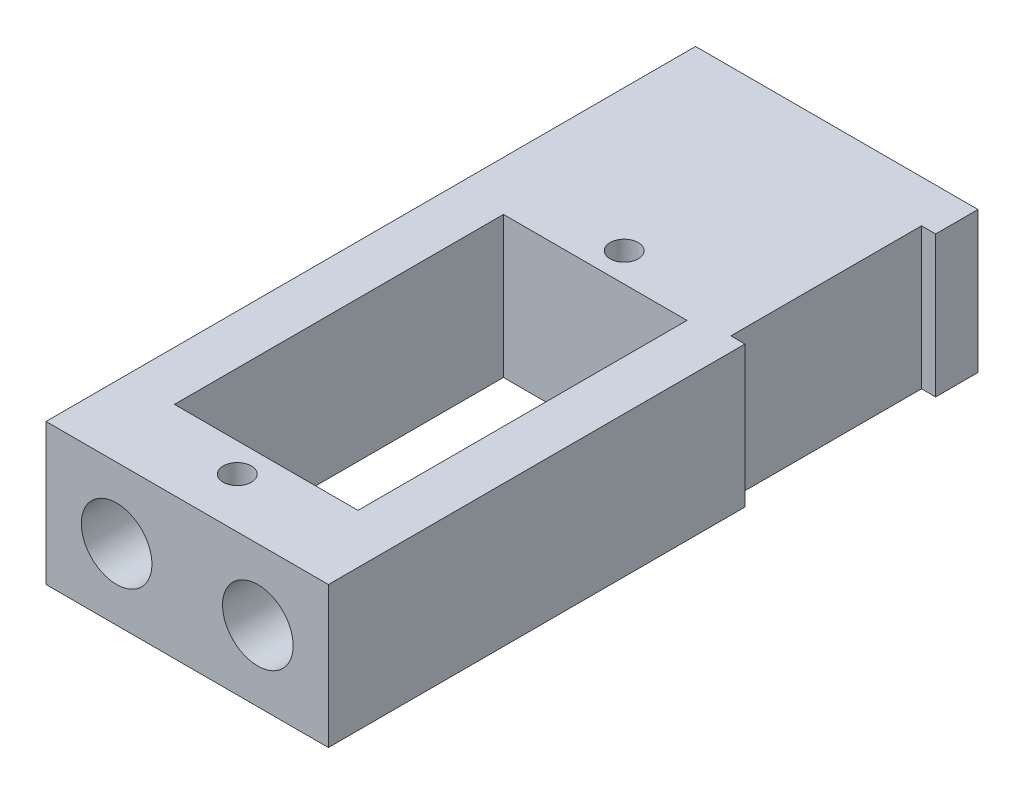
ISO-10303-21;
HEADER;
FILE_DESCRIPTION(('STEP AP214'),'2;1');
FILE_NAME('part.step','',(''),(''),'','','');
FILE_SCHEMA(('AUTOMOTIVE_DESIGN { 1 0 10303 214 1 1 1 1 }'));
ENDSEC;
DATA;
#1=APPLICATION_CONTEXT('core data for automotive mechanical design processes');
#2=APPLICATION_PROTOCOL_DEFINITION('international standard','automotive_design',2000,#1);
#3=PRODUCT_CONTEXT('',#1,'mechanical');
#4=PRODUCT('Part','Part','',(#3));
#5=PRODUCT_RELATED_PRODUCT_CATEGORY('part','',(#4));
#6=PRODUCT_DEFINITION_FORMATION('','',#4);
#7=PRODUCT_DEFINITION_CONTEXT('part definition',#1,'design');
#8=PRODUCT_DEFINITION('design','',#6,#7);
#9=PRODUCT_DEFINITION_SHAPE('','',#8);
#10=(LENGTH_UNIT() NAMED_UNIT(*) SI_UNIT(.MILLI.,.METRE.));
#11=(NAMED_UNIT(*) PLANE_ANGLE_UNIT() SI_UNIT($,.RADIAN.));
#12=(NAMED_UNIT(*) SI_UNIT($,.STERADIAN.) SOLID_ANGLE_UNIT());
#13=UNCERTAINTY_MEASURE_WITH_UNIT(LENGTH_MEASURE(1.E-05),#10,'distance_accuracy_value','');
#14=(GEOMETRIC_REPRESENTATION_CONTEXT(3) GLOBAL_UNCERTAINTY_ASSIGNED_CONTEXT((#13)) GLOBAL_UNIT_ASSIGNED_CONTEXT((#10,
#11,#12)) REPRESENTATION_CONTEXT('',''));
#15=CARTESIAN_POINT('',(0.,0.,0.));
#16=DIRECTION('',(0.,0.,1.));
#17=DIRECTION('',(1.,0.,0.));
#18=AXIS2_PLACEMENT_3D('',#15,#16,#17);
#19=CARTESIAN_POINT('',(9.99999999999999,10.,-23.));
#20=DIRECTION('',(-1.,0.,0.));
#21=DIRECTION('',(0.,0.,1.));
#22=AXIS2_PLACEMENT_3D('',#19,#20,#21);
#23=PLANE('',#22);
#24=DIRECTION('',(0.,0.,-1.));
#25=VECTOR('',#24,1.);
#26=CARTESIAN_POINT('',(9.99999999999999,10.,-23.));
#27=LINE('',#26,#25);
#28=CARTESIAN_POINT('',(9.99999999999999,10.,-20.));
#29=VERTEX_POINT('',#28);
#30=CARTESIAN_POINT('',(9.99999999999999,10.,-23.));
#31=VERTEX_POINT('',#30);
#32=EDGE_CURVE('E225',#29,#31,#27,.T.);
#33=ORIENTED_EDGE('',*,*,#32,.F.);
#34=DIRECTION('',(0.,1.,0.));
#35=VECTOR('',#34,1.);
#36=CARTESIAN_POINT('',(9.99999999999999,0.,-20.));
#37=LINE('',#36,#35);
#38=CARTESIAN_POINT('',(9.99999999999999,0.,-20.));
#39=VERTEX_POINT('',#38);
#40=EDGE_CURVE('E126',#39,#29,#37,.T.);
#41=ORIENTED_EDGE('',*,*,#40,.F.);
#42=DIRECTION('',(0.,0.,-1.));
#43=VECTOR('',#42,1.);
#44=CARTESIAN_POINT('',(9.99999999999999,0.,-23.));
#45=LINE('',#44,#43);
#46=CARTESIAN_POINT('',(9.99999999999999,0.,-23.));
#47=VERTEX_POINT('',#46);
#48=EDGE_CURVE('E216',#39,#47,#45,.T.);
#49=ORIENTED_EDGE('',*,*,#48,.T.);
#50=DIRECTION('',(0.,-1.,0.));
#51=VECTOR('',#50,1.);
#52=CARTESIAN_POINT('',(9.99999999999999,10.,-23.));
#53=LINE('',#52,#51);
#54=EDGE_CURVE('E11',#31,#47,#53,.T.);
#55=ORIENTED_EDGE('',*,*,#54,.F.);
#56=EDGE_LOOP('',(#33,#41,#49,#55));
#57=FACE_BOUND('',#56,.T.);
#58=ADVANCED_FACE('F32',(#57),#23,.F.);
#59=CARTESIAN_POINT('',(10.,0.,23.));
#60=VERTEX_POINT('',#59);
#61=CARTESIAN_POINT('',(10.,0.,-6.49999999999999));
#62=VERTEX_POINT('',#61);
#63=EDGE_CURVE('E232',#60,#62,#45,.T.);
#64=ORIENTED_EDGE('',*,*,#63,.T.);
#65=DIRECTION('',(0.,-1.,0.));
#66=VECTOR('',#65,1.);
#67=CARTESIAN_POINT('',(10.,0.,-6.49999999999999));
#68=LINE('',#67,#66);
#69=CARTESIAN_POINT('',(10.,10.,-6.49999999999999));
#70=VERTEX_POINT('',#69);
#71=EDGE_CURVE('E138',#70,#62,#68,.T.);
#72=ORIENTED_EDGE('',*,*,#71,.F.);
#73=CARTESIAN_POINT('',(10.,10.,23.));
#74=VERTEX_POINT('',#73);
#75=EDGE_CURVE('E222',#74,#70,#27,.T.);
#76=ORIENTED_EDGE('',*,*,#75,.F.);
#77=DIRECTION('',(0.,-1.,0.));
#78=VECTOR('',#77,1.);
#79=CARTESIAN_POINT('',(10.,10.,23.));
#80=LINE('',#79,#78);
#81=EDGE_CURVE('E231',#74,#60,#80,.T.);
#82=ORIENTED_EDGE('',*,*,#81,.T.);
#83=EDGE_LOOP('',(#64,#72,#76,#82));
#84=FACE_BOUND('',#83,.T.);
#85=ADVANCED_FACE('F34',(#84),#23,.F.);
#86=CARTESIAN_POINT('',(-10.,10.,-23.));
#87=DIRECTION('',(0.,0.,1.));
#88=DIRECTION('',(1.,0.,0.));
#89=AXIS2_PLACEMENT_3D('',#86,#87,#88);
#90=PLANE('',#89);
#91=CARTESIAN_POINT('',(5.,5.,-23.));
#92=DIRECTION('',(0.,0.,-1.));
#93=DIRECTION('',(1.,0.,0.));
#94=AXIS2_PLACEMENT_3D('',#91,#92,#93);
#95=CIRCLE('',#94,2.5);
#96=CARTESIAN_POINT('',(7.5,5.,-23.));
#97=VERTEX_POINT('',#96);
#98=EDGE_CURVE('E165',#97,#97,#95,.T.);
#99=ORIENTED_EDGE('',*,*,#98,.F.);
#100=EDGE_LOOP('',(#99));
#101=FACE_BOUND('',#100,.T.);
#102=CARTESIAN_POINT('',(-5.,5.,-23.));
#103=DIRECTION('',(0.,0.,-1.));
#104=DIRECTION('',(-1.,0.,0.));
#105=AXIS2_PLACEMENT_3D('',#102,#103,#104);
#106=CIRCLE('',#105,2.5);
#107=CARTESIAN_POINT('',(-7.5,5.,-23.));
#108=VERTEX_POINT('',#107);
#109=EDGE_CURVE('E171',#108,#108,#106,.T.);
#110=ORIENTED_EDGE('',*,*,#109,.F.);
#111=EDGE_LOOP('',(#110));
#112=FACE_BOUND('',#111,.T.);
#113=DIRECTION('',(-1.,0.,0.));
#114=VECTOR('',#113,1.);
#115=CARTESIAN_POINT('',(-10.,0.,-23.));
#116=LINE('',#115,#114);
#117=CARTESIAN_POINT('',(-10.,0.,-23.));
#118=VERTEX_POINT('',#117);
#119=EDGE_CURVE('E235',#47,#118,#116,.T.);
#120=ORIENTED_EDGE('',*,*,#119,.T.);
#121=DIRECTION('',(0.,-1.,0.));
#122=VECTOR('',#121,1.);
#123=CARTESIAN_POINT('',(-10.,10.,-23.));
#124=LINE('',#123,#122);
#125=CARTESIAN_POINT('',(-10.,10.,-23.));
#126=VERTEX_POINT('',#125);
#127=EDGE_CURVE('E40',#126,#118,#124,.T.);
#128=ORIENTED_EDGE('',*,*,#127,.F.);
#129=DIRECTION('',(-1.,0.,0.));
#130=VECTOR('',#129,1.);
#131=CARTESIAN_POINT('',(-10.,10.,-23.));
#132=LINE('',#131,#130);
#133=EDGE_CURVE('E224',#31,#126,#132,.T.);
#134=ORIENTED_EDGE('',*,*,#133,.F.);
#135=ORIENTED_EDGE('',*,*,#54,.T.);
#136=EDGE_LOOP('',(#120,#128,#134,#135));
#137=FACE_BOUND('',#136,.T.);
#138=ADVANCED_FACE('F269',(#101,#112,#137),#90,.F.);
#139=CARTESIAN_POINT('',(-10.,10.,-23.));
#140=DIRECTION('',(1.,0.,0.));
#141=DIRECTION('',(0.,0.,-1.));
#142=AXIS2_PLACEMENT_3D('',#139,#140,#141);
#143=PLANE('',#142);
#144=DIRECTION('',(0.,0.,1.));
#145=VECTOR('',#144,1.);
#146=CARTESIAN_POINT('',(-10.,0.,-23.));
#147=LINE('',#146,#145);
#148=CARTESIAN_POINT('',(-10.,0.,23.));
#149=VERTEX_POINT('',#148);
#150=EDGE_CURVE('E237',#118,#149,#147,.T.);
#151=ORIENTED_EDGE('',*,*,#150,.T.);
#152=DIRECTION('',(0.,-1.,0.));
#153=VECTOR('',#152,1.);
#154=CARTESIAN_POINT('',(-10.,10.,23.));
#155=LINE('',#154,#153);
#156=CARTESIAN_POINT('',(-10.,10.,23.));
#157=VERTEX_POINT('',#156);
#158=EDGE_CURVE('E243',#157,#149,#155,.T.);
#159=ORIENTED_EDGE('',*,*,#158,.F.);
#160=DIRECTION('',(0.,0.,1.));
#161=VECTOR('',#160,1.);
#162=CARTESIAN_POINT('',(-10.,10.,-23.));
#163=LINE('',#162,#161);
#164=EDGE_CURVE('E227',#126,#157,#163,.T.);
#165=ORIENTED_EDGE('',*,*,#164,.F.);
#166=ORIENTED_EDGE('',*,*,#127,.T.);
#167=EDGE_LOOP('',(#151,#159,#165,#166));
#168=FACE_BOUND('',#167,.T.);
#169=ADVANCED_FACE('F250',(#168),#143,.F.);
#170=CARTESIAN_POINT('',(-10.,10.,23.));
#171=DIRECTION('',(0.,0.,-1.));
#172=DIRECTION('',(-1.,0.,0.));
#173=AXIS2_PLACEMENT_3D('',#170,#171,#172);
#174=PLANE('',#173);
#175=CARTESIAN_POINT('',(-5.,5.,23.));
#176=DIRECTION('',(0.,0.,1.));
#177=DIRECTION('',(-1.,0.,0.));
#178=AXIS2_PLACEMENT_3D('',#175,#176,#177);
#179=CIRCLE('',#178,2.5);
#180=CARTESIAN_POINT('',(-7.5,5.,23.));
#181=VERTEX_POINT('',#180);
#182=EDGE_CURVE('E151',#181,#181,#179,.T.);
#183=ORIENTED_EDGE('',*,*,#182,.F.);
#184=EDGE_LOOP('',(#183));
#185=FACE_BOUND('',#184,.T.);
#186=CARTESIAN_POINT('',(5.,5.,23.));
#187=DIRECTION('',(0.,0.,1.));
#188=DIRECTION('',(1.,0.,0.));
#189=AXIS2_PLACEMENT_3D('',#186,#187,#188);
#190=CIRCLE('',#189,2.5);
#191=CARTESIAN_POINT('',(7.5,5.,23.));
#192=VERTEX_POINT('',#191);
#193=EDGE_CURVE('E159',#192,#192,#190,.T.);
#194=ORIENTED_EDGE('',*,*,#193,.F.);
#195=EDGE_LOOP('',(#194));
#196=FACE_BOUND('',#195,.T.);
#197=DIRECTION('',(1.,0.,0.));
#198=VECTOR('',#197,1.);
#199=CARTESIAN_POINT('',(-10.,0.,23.));
#200=LINE('',#199,#198);
#201=EDGE_CURVE('E239',#149,#60,#200,.T.);
#202=ORIENTED_EDGE('',*,*,#201,.T.);
#203=ORIENTED_EDGE('',*,*,#81,.F.);
#204=DIRECTION('',(1.,0.,0.));
#205=VECTOR('',#204,1.);
#206=CARTESIAN_POINT('',(-10.,10.,23.));
#207=LINE('',#206,#205);
#208=EDGE_CURVE('E229',#157,#74,#207,.T.);
#209=ORIENTED_EDGE('',*,*,#208,.F.);
#210=ORIENTED_EDGE('',*,*,#158,.T.);
#211=EDGE_LOOP('',(#202,#203,#209,#210));
#212=FACE_BOUND('',#211,.T.);
#213=ADVANCED_FACE('F263',(#185,#196,#212),#174,.F.);
#214=CARTESIAN_POINT('',(0.,10.,0.));
#215=DIRECTION('',(0.,1.,0.));
#216=DIRECTION('',(0.,0.,1.));
#217=AXIS2_PLACEMENT_3D('',#214,#215,#216);
#218=PLANE('',#217);
#219=DIRECTION('',(1.,0.,0.));
#220=VECTOR('',#219,1.);
#221=CARTESIAN_POINT('',(8.99999999999999,10.,-20.));
#222=LINE('',#221,#220);
#223=CARTESIAN_POINT('',(8.99999999999999,10.,-20.));
#224=VERTEX_POINT('',#223);
#225=EDGE_CURVE('E121',#224,#29,#222,.T.);
#226=ORIENTED_EDGE('',*,*,#225,.T.);
#227=ORIENTED_EDGE('',*,*,#32,.T.);
#228=ORIENTED_EDGE('',*,*,#133,.T.);
#229=ORIENTED_EDGE('',*,*,#164,.T.);
#230=ORIENTED_EDGE('',*,*,#208,.T.);
#231=ORIENTED_EDGE('',*,*,#75,.T.);
#232=DIRECTION('',(1.,0.,0.));
#233=VECTOR('',#232,1.);
#234=CARTESIAN_POINT('',(9.,10.,-6.49999999999999));
#235=LINE('',#234,#233);
#236=CARTESIAN_POINT('',(9.,10.,-6.49999999999999));
#237=VERTEX_POINT('',#236);
#238=EDGE_CURVE('E130',#237,#70,#235,.T.);
#239=ORIENTED_EDGE('',*,*,#238,.F.);
#240=DIRECTION('',(0.,0.,1.));
#241=VECTOR('',#240,1.);
#242=CARTESIAN_POINT('',(8.99999999999999,10.,-20.));
#243=LINE('',#242,#241);
#244=EDGE_CURVE('E134',#224,#237,#243,.T.);
#245=ORIENTED_EDGE('',*,*,#244,.F.);
#246=EDGE_LOOP('',(#226,#227,#228,#229,#230,#231,#239,#245));
#247=FACE_BOUND('',#246,.T.);
#248=CARTESIAN_POINT('',(0.,10.,19.455));
#249=DIRECTION('',(0.,1.,0.));
#250=DIRECTION('',(0.,0.,-1.));
#251=AXIS2_PLACEMENT_3D('',#248,#249,#250);
#252=CIRCLE('',#251,1.);
#253=CARTESIAN_POINT('',(0.,10.,18.455));
#254=VERTEX_POINT('',#253);
#255=EDGE_CURVE('E183',#254,#254,#252,.T.);
#256=ORIENTED_EDGE('',*,*,#255,.F.);
#257=EDGE_LOOP('',(#256));
#258=FACE_BOUND('',#257,.T.);
#259=CARTESIAN_POINT('',(0.,10.,-7.945));
#260=DIRECTION('',(0.,1.,0.));
#261=DIRECTION('',(0.,0.,1.));
#262=AXIS2_PLACEMENT_3D('',#259,#260,#261);
#263=CIRCLE('',#262,1.);
#264=CARTESIAN_POINT('',(0.,10.,-6.945));
#265=VERTEX_POINT('',#264);
#266=EDGE_CURVE('E177',#265,#265,#263,.T.);
#267=ORIENTED_EDGE('',*,*,#266,.F.);
#268=EDGE_LOOP('',(#267));
#269=FACE_BOUND('',#268,.T.);
#270=DIRECTION('',(0.,0.,-1.));
#271=VECTOR('',#270,1.);
#272=CARTESIAN_POINT('',(6.49999999999999,10.,-5.89500000000001));
#273=LINE('',#272,#271);
#274=CARTESIAN_POINT('',(6.5,10.,17.405));
#275=VERTEX_POINT('',#274);
#276=CARTESIAN_POINT('',(6.49999999999999,10.,-5.89500000000001));
#277=VERTEX_POINT('',#276);
#278=EDGE_CURVE('E55',#275,#277,#273,.T.);
#279=ORIENTED_EDGE('',*,*,#278,.F.);
#280=DIRECTION('',(1.,0.,0.));
#281=VECTOR('',#280,1.);
#282=CARTESIAN_POINT('',(-6.5,10.,17.405));
#283=LINE('',#282,#281);
#284=CARTESIAN_POINT('',(-6.5,10.,17.405));
#285=VERTEX_POINT('',#284);
#286=EDGE_CURVE('E195',#285,#275,#283,.T.);
#287=ORIENTED_EDGE('',*,*,#286,.F.);
#288=DIRECTION('',(0.,0.,1.));
#289=VECTOR('',#288,1.);
#290=CARTESIAN_POINT('',(-6.5,10.,-5.89500000000001));
#291=LINE('',#290,#289);
#292=CARTESIAN_POINT('',(-6.5,10.,-5.89500000000001));
#293=VERTEX_POINT('',#292);
#294=EDGE_CURVE('E209',#293,#285,#291,.T.);
#295=ORIENTED_EDGE('',*,*,#294,.F.);
#296=DIRECTION('',(-1.,0.,0.));
#297=VECTOR('',#296,1.);
#298=CARTESIAN_POINT('',(-6.5,10.,-5.89500000000001));
#299=LINE('',#298,#297);
#300=EDGE_CURVE('E206',#277,#293,#299,.T.);
#301=ORIENTED_EDGE('',*,*,#300,.F.);
#302=EDGE_LOOP('',(#279,#287,#295,#301));
#303=FACE_BOUND('',#302,.T.);
#304=ADVANCED_FACE('F140',(#247,#258,#269,#303),#218,.T.);
#305=CARTESIAN_POINT('',(0.,0.,0.));
#306=DIRECTION('',(0.,1.,0.));
#307=DIRECTION('',(0.,0.,1.));
#308=AXIS2_PLACEMENT_3D('',#305,#306,#307);
#309=PLANE('',#308);
#310=ORIENTED_EDGE('',*,*,#48,.F.);
#311=DIRECTION('',(1.,0.,0.));
#312=VECTOR('',#311,1.);
#313=CARTESIAN_POINT('',(8.99999999999999,0.,-20.));
#314=LINE('',#313,#312);
#315=CARTESIAN_POINT('',(8.99999999999999,0.,-20.));
#316=VERTEX_POINT('',#315);
#317=EDGE_CURVE('E149',#316,#39,#314,.T.);
#318=ORIENTED_EDGE('',*,*,#317,.F.);
#319=DIRECTION('',(0.,0.,-1.));
#320=VECTOR('',#319,1.);
#321=CARTESIAN_POINT('',(8.99999999999999,0.,-20.));
#322=LINE('',#321,#320);
#323=CARTESIAN_POINT('',(9.,0.,-6.49999999999999));
#324=VERTEX_POINT('',#323);
#325=EDGE_CURVE('E131',#324,#316,#322,.T.);
#326=ORIENTED_EDGE('',*,*,#325,.F.);
#327=DIRECTION('',(1.,0.,0.));
#328=VECTOR('',#327,1.);
#329=CARTESIAN_POINT('',(9.,0.,-6.49999999999999));
#330=LINE('',#329,#328);
#331=EDGE_CURVE('E152',#324,#62,#330,.T.);
#332=ORIENTED_EDGE('',*,*,#331,.T.);
#333=ORIENTED_EDGE('',*,*,#63,.F.);
#334=ORIENTED_EDGE('',*,*,#201,.F.);
#335=ORIENTED_EDGE('',*,*,#150,.F.);
#336=ORIENTED_EDGE('',*,*,#119,.F.);
#337=EDGE_LOOP('',(#310,#318,#326,#332,#333,#334,#335,#336));
#338=FACE_BOUND('',#337,.T.);
#339=CARTESIAN_POINT('',(0.,0.,19.455));
#340=DIRECTION('',(0.,1.,0.));
#341=DIRECTION('',(0.,0.,-1.));
#342=AXIS2_PLACEMENT_3D('',#339,#340,#341);
#343=CIRCLE('',#342,1.);
#344=CARTESIAN_POINT('',(0.,0.,18.455));
#345=VERTEX_POINT('',#344);
#346=EDGE_CURVE('E180',#345,#345,#343,.T.);
#347=ORIENTED_EDGE('',*,*,#346,.T.);
#348=EDGE_LOOP('',(#347));
#349=FACE_BOUND('',#348,.T.);
#350=CARTESIAN_POINT('',(0.,0.,-7.945));
#351=DIRECTION('',(0.,1.,0.));
#352=DIRECTION('',(0.,0.,1.));
#353=AXIS2_PLACEMENT_3D('',#350,#351,#352);
#354=CIRCLE('',#353,1.);
#355=CARTESIAN_POINT('',(0.,0.,-6.945));
#356=VERTEX_POINT('',#355);
#357=EDGE_CURVE('E186',#356,#356,#354,.T.);
#358=ORIENTED_EDGE('',*,*,#357,.T.);
#359=EDGE_LOOP('',(#358));
#360=FACE_BOUND('',#359,.T.);
#361=DIRECTION('',(1.,0.,0.));
#362=VECTOR('',#361,1.);
#363=CARTESIAN_POINT('',(-6.5,0.,17.405));
#364=LINE('',#363,#362);
#365=CARTESIAN_POINT('',(-6.5,0.,17.405));
#366=VERTEX_POINT('',#365);
#367=CARTESIAN_POINT('',(6.5,0.,17.405));
#368=VERTEX_POINT('',#367);
#369=EDGE_CURVE('E201',#366,#368,#364,.T.);
#370=ORIENTED_EDGE('',*,*,#369,.T.);
#371=DIRECTION('',(0.,0.,-1.));
#372=VECTOR('',#371,1.);
#373=CARTESIAN_POINT('',(6.49999999999999,0.,-5.89500000000001));
#374=LINE('',#373,#372);
#375=CARTESIAN_POINT('',(6.49999999999999,0.,-5.89500000000001));
#376=VERTEX_POINT('',#375);
#377=EDGE_CURVE('E191',#368,#376,#374,.T.);
#378=ORIENTED_EDGE('',*,*,#377,.T.);
#379=DIRECTION('',(-1.,0.,0.));
#380=VECTOR('',#379,1.);
#381=CARTESIAN_POINT('',(-6.5,0.,-5.89500000000001));
#382=LINE('',#381,#380);
#383=CARTESIAN_POINT('',(-6.5,0.,-5.89500000000001));
#384=VERTEX_POINT('',#383);
#385=EDGE_CURVE('E194',#376,#384,#382,.T.);
#386=ORIENTED_EDGE('',*,*,#385,.T.);
#387=DIRECTION('',(0.,0.,1.));
#388=VECTOR('',#387,1.);
#389=CARTESIAN_POINT('',(-6.5,0.,-5.89500000000001));
#390=LINE('',#389,#388);
#391=EDGE_CURVE('E198',#384,#366,#390,.T.);
#392=ORIENTED_EDGE('',*,*,#391,.T.);
#393=EDGE_LOOP('',(#370,#378,#386,#392));
#394=FACE_BOUND('',#393,.T.);
#395=ADVANCED_FACE('F258',(#338,#349,#360,#394),#309,.F.);
#396=CARTESIAN_POINT('',(6.49999999999999,0.,-5.89500000000001));
#397=DIRECTION('',(1.,0.,0.));
#398=DIRECTION('',(0.,0.,-1.));
#399=AXIS2_PLACEMENT_3D('',#396,#397,#398);
#400=PLANE('',#399);
#401=ORIENTED_EDGE('',*,*,#278,.T.);
#402=DIRECTION('',(0.,1.,0.));
#403=VECTOR('',#402,1.);
#404=CARTESIAN_POINT('',(6.49999999999999,0.,-5.89500000000001));
#405=LINE('',#404,#403);
#406=EDGE_CURVE('E204',#376,#277,#405,.T.);
#407=ORIENTED_EDGE('',*,*,#406,.F.);
#408=ORIENTED_EDGE('',*,*,#377,.F.);
#409=DIRECTION('',(0.,1.,0.));
#410=VECTOR('',#409,1.);
#411=CARTESIAN_POINT('',(6.5,0.,17.405));
#412=LINE('',#411,#410);
#413=EDGE_CURVE('E214',#368,#275,#412,.T.);
#414=ORIENTED_EDGE('',*,*,#413,.T.);
#415=EDGE_LOOP('',(#401,#407,#408,#414));
#416=FACE_BOUND('',#415,.T.);
#417=ADVANCED_FACE('F302',(#416),#400,.F.);
#418=CARTESIAN_POINT('',(-6.5,0.,17.405));
#419=DIRECTION('',(0.,0.,1.));
#420=DIRECTION('',(1.,0.,0.));
#421=AXIS2_PLACEMENT_3D('',#418,#419,#420);
#422=PLANE('',#421);
#423=ORIENTED_EDGE('',*,*,#286,.T.);
#424=ORIENTED_EDGE('',*,*,#413,.F.);
#425=ORIENTED_EDGE('',*,*,#369,.F.);
#426=DIRECTION('',(0.,1.,0.));
#427=VECTOR('',#426,1.);
#428=CARTESIAN_POINT('',(-6.5,0.,17.405));
#429=LINE('',#428,#427);
#430=EDGE_CURVE('E217',#366,#285,#429,.T.);
#431=ORIENTED_EDGE('',*,*,#430,.T.);
#432=EDGE_LOOP('',(#423,#424,#425,#431));
#433=FACE_BOUND('',#432,.T.);
#434=ADVANCED_FACE('F307',(#433),#422,.F.);
#435=CARTESIAN_POINT('',(-6.5,0.,-5.89500000000001));
#436=DIRECTION('',(-1.,0.,0.));
#437=DIRECTION('',(0.,0.,1.));
#438=AXIS2_PLACEMENT_3D('',#435,#436,#437);
#439=PLANE('',#438);
#440=ORIENTED_EDGE('',*,*,#294,.T.);
#441=ORIENTED_EDGE('',*,*,#430,.F.);
#442=ORIENTED_EDGE('',*,*,#391,.F.);
#443=DIRECTION('',(0.,1.,0.));
#444=VECTOR('',#443,1.);
#445=CARTESIAN_POINT('',(-6.5,0.,-5.89500000000001));
#446=LINE('',#445,#444);
#447=EDGE_CURVE('E219',#384,#293,#446,.T.);
#448=ORIENTED_EDGE('',*,*,#447,.T.);
#449=EDGE_LOOP('',(#440,#441,#442,#448));
#450=FACE_BOUND('',#449,.T.);
#451=ADVANCED_FACE('F312',(#450),#439,.F.);
#452=CARTESIAN_POINT('',(-6.5,0.,-5.89500000000001));
#453=DIRECTION('',(0.,0.,-1.));
#454=DIRECTION('',(-1.,0.,0.));
#455=AXIS2_PLACEMENT_3D('',#452,#453,#454);
#456=PLANE('',#455);
#457=ORIENTED_EDGE('',*,*,#300,.T.);
#458=ORIENTED_EDGE('',*,*,#447,.F.);
#459=ORIENTED_EDGE('',*,*,#385,.F.);
#460=ORIENTED_EDGE('',*,*,#406,.T.);
#461=EDGE_LOOP('',(#457,#458,#459,#460));
#462=FACE_BOUND('',#461,.T.);
#463=ADVANCED_FACE('F308',(#462),#456,.F.);
#464=CARTESIAN_POINT('',(0.,0.,-7.945));
#465=DIRECTION('',(0.,1.,0.));
#466=DIRECTION('',(0.,0.,1.));
#467=AXIS2_PLACEMENT_3D('',#464,#465,#466);
#468=CYLINDRICAL_SURFACE('',#467,1.);
#469=ORIENTED_EDGE('',*,*,#357,.F.);
#470=EDGE_LOOP('',(#469));
#471=FACE_BOUND('',#470,.T.);
#472=ORIENTED_EDGE('',*,*,#266,.T.);
#473=EDGE_LOOP('',(#472));
#474=FACE_BOUND('',#473,.T.);
#475=ADVANCED_FACE('F311',(#471,#474),#468,.F.);
#476=CARTESIAN_POINT('',(0.,0.,19.455));
#477=DIRECTION('',(0.,1.,0.));
#478=DIRECTION('',(0.,0.,1.));
#479=AXIS2_PLACEMENT_3D('',#476,#477,#478);
#480=CYLINDRICAL_SURFACE('',#479,1.);
#481=ORIENTED_EDGE('',*,*,#346,.F.);
#482=EDGE_LOOP('',(#481));
#483=FACE_BOUND('',#482,.T.);
#484=ORIENTED_EDGE('',*,*,#255,.T.);
#485=EDGE_LOOP('',(#484));
#486=FACE_BOUND('',#485,.T.);
#487=ADVANCED_FACE('F322',(#483,#486),#480,.F.);
#488=CARTESIAN_POINT('',(-5.,5.,-19.));
#489=DIRECTION('',(0.,0.,-1.));
#490=DIRECTION('',(-1.,0.,0.));
#491=AXIS2_PLACEMENT_3D('',#488,#489,#490);
#492=CYLINDRICAL_SURFACE('',#491,2.5);
#493=CARTESIAN_POINT('',(-5.,5.,-19.));
#494=DIRECTION('',(0.,0.,-1.));
#495=DIRECTION('',(-1.,0.,0.));
#496=AXIS2_PLACEMENT_3D('',#493,#494,#495);
#497=CIRCLE('',#496,2.5);
#498=CARTESIAN_POINT('',(-7.5,5.,-19.));
#499=VERTEX_POINT('',#498);
#500=EDGE_CURVE('E174',#499,#499,#497,.T.);
#501=ORIENTED_EDGE('',*,*,#500,.F.);
#502=EDGE_LOOP('',(#501));
#503=FACE_BOUND('',#502,.T.);
#504=ORIENTED_EDGE('',*,*,#109,.T.);
#505=EDGE_LOOP('',(#504));
#506=FACE_BOUND('',#505,.T.);
#507=ADVANCED_FACE('F326',(#503,#506),#492,.F.);
#508=CARTESIAN_POINT('',(-5.,5.,-19.));
#509=DIRECTION('',(0.,0.,-1.));
#510=DIRECTION('',(-1.,0.,0.));
#511=AXIS2_PLACEMENT_3D('',#508,#509,#510);
#512=PLANE('',#511);
#513=ORIENTED_EDGE('',*,*,#500,.T.);
#514=EDGE_LOOP('',(#513));
#515=FACE_BOUND('',#514,.T.);
#516=ADVANCED_FACE('F330',(#515),#512,.T.);
#517=CARTESIAN_POINT('',(5.,5.,-19.));
#518=DIRECTION('',(0.,0.,-1.));
#519=DIRECTION('',(-1.,0.,0.));
#520=AXIS2_PLACEMENT_3D('',#517,#518,#519);
#521=CYLINDRICAL_SURFACE('',#520,2.5);
#522=CARTESIAN_POINT('',(5.,5.,-19.));
#523=DIRECTION('',(0.,0.,-1.));
#524=DIRECTION('',(1.,0.,0.));
#525=AXIS2_PLACEMENT_3D('',#522,#523,#524);
#526=CIRCLE('',#525,2.5);
#527=CARTESIAN_POINT('',(7.5,5.,-19.));
#528=VERTEX_POINT('',#527);
#529=EDGE_CURVE('E168',#528,#528,#526,.T.);
#530=ORIENTED_EDGE('',*,*,#529,.F.);
#531=EDGE_LOOP('',(#530));
#532=FACE_BOUND('',#531,.T.);
#533=ORIENTED_EDGE('',*,*,#98,.T.);
#534=EDGE_LOOP('',(#533));
#535=FACE_BOUND('',#534,.T.);
#536=ADVANCED_FACE('F334',(#532,#535),#521,.F.);
#537=CARTESIAN_POINT('',(5.,5.,-19.));
#538=DIRECTION('',(0.,0.,1.));
#539=DIRECTION('',(1.,0.,0.));
#540=AXIS2_PLACEMENT_3D('',#537,#538,#539);
#541=PLANE('',#540);
#542=ORIENTED_EDGE('',*,*,#529,.T.);
#543=EDGE_LOOP('',(#542));
#544=FACE_BOUND('',#543,.T.);
#545=ADVANCED_FACE('F338',(#544),#541,.F.);
#546=CARTESIAN_POINT('',(5.,5.,19.));
#547=DIRECTION('',(0.,0.,1.));
#548=DIRECTION('',(1.,0.,0.));
#549=AXIS2_PLACEMENT_3D('',#546,#547,#548);
#550=CYLINDRICAL_SURFACE('',#549,2.5);
#551=CARTESIAN_POINT('',(5.,5.,19.));
#552=DIRECTION('',(0.,0.,1.));
#553=DIRECTION('',(1.,0.,0.));
#554=AXIS2_PLACEMENT_3D('',#551,#552,#553);
#555=CIRCLE('',#554,2.5);
#556=CARTESIAN_POINT('',(7.5,5.,19.));
#557=VERTEX_POINT('',#556);
#558=EDGE_CURVE('E162',#557,#557,#555,.T.);
#559=ORIENTED_EDGE('',*,*,#558,.F.);
#560=EDGE_LOOP('',(#559));
#561=FACE_BOUND('',#560,.T.);
#562=ORIENTED_EDGE('',*,*,#193,.T.);
#563=EDGE_LOOP('',(#562));
#564=FACE_BOUND('',#563,.T.);
#565=ADVANCED_FACE('F342',(#561,#564),#550,.F.);
#566=CARTESIAN_POINT('',(5.,5.,19.));
#567=DIRECTION('',(0.,0.,1.));
#568=DIRECTION('',(1.,0.,0.));
#569=AXIS2_PLACEMENT_3D('',#566,#567,#568);
#570=PLANE('',#569);
#571=ORIENTED_EDGE('',*,*,#558,.T.);
#572=EDGE_LOOP('',(#571));
#573=FACE_BOUND('',#572,.T.);
#574=ADVANCED_FACE('F346',(#573),#570,.T.);
#575=CARTESIAN_POINT('',(-5.,5.,19.));
#576=DIRECTION('',(0.,0.,1.));
#577=DIRECTION('',(1.,0.,0.));
#578=AXIS2_PLACEMENT_3D('',#575,#576,#577);
#579=CYLINDRICAL_SURFACE('',#578,2.5);
#580=CARTESIAN_POINT('',(-5.,5.,19.));
#581=DIRECTION('',(0.,0.,1.));
#582=DIRECTION('',(-1.,0.,0.));
#583=AXIS2_PLACEMENT_3D('',#580,#581,#582);
#584=CIRCLE('',#583,2.5);
#585=CARTESIAN_POINT('',(-7.5,5.,19.));
#586=VERTEX_POINT('',#585);
#587=EDGE_CURVE('E156',#586,#586,#584,.T.);
#588=ORIENTED_EDGE('',*,*,#587,.F.);
#589=EDGE_LOOP('',(#588));
#590=FACE_BOUND('',#589,.T.);
#591=ORIENTED_EDGE('',*,*,#182,.T.);
#592=EDGE_LOOP('',(#591));
#593=FACE_BOUND('',#592,.T.);
#594=ADVANCED_FACE('F350',(#590,#593),#579,.F.);
#595=CARTESIAN_POINT('',(-5.,5.,19.));
#596=DIRECTION('',(0.,0.,-1.));
#597=DIRECTION('',(-1.,0.,0.));
#598=AXIS2_PLACEMENT_3D('',#595,#596,#597);
#599=PLANE('',#598);
#600=ORIENTED_EDGE('',*,*,#587,.T.);
#601=EDGE_LOOP('',(#600));
#602=FACE_BOUND('',#601,.T.);
#603=ADVANCED_FACE('F280',(#602),#599,.F.);
#604=CARTESIAN_POINT('',(8.99999999999999,0.,-20.));
#605=DIRECTION('',(0.,0.,-1.));
#606=DIRECTION('',(0.,1.,0.));
#607=AXIS2_PLACEMENT_3D('',#604,#605,#606);
#608=PLANE('',#607);
#609=ORIENTED_EDGE('',*,*,#40,.T.);
#610=ORIENTED_EDGE('',*,*,#225,.F.);
#611=DIRECTION('',(0.,1.,0.));
#612=VECTOR('',#611,1.);
#613=CARTESIAN_POINT('',(8.99999999999999,0.,-20.));
#614=LINE('',#613,#612);
#615=EDGE_CURVE('E124',#316,#224,#614,.T.);
#616=ORIENTED_EDGE('',*,*,#615,.F.);
#617=ORIENTED_EDGE('',*,*,#317,.T.);
#618=EDGE_LOOP('',(#609,#610,#616,#617));
#619=FACE_BOUND('',#618,.T.);
#620=ADVANCED_FACE('F123',(#619),#608,.F.);
#621=CARTESIAN_POINT('',(9.,0.,-6.49999999999999));
#622=DIRECTION('',(0.,0.,1.));
#623=DIRECTION('',(1.,0.,0.));
#624=AXIS2_PLACEMENT_3D('',#621,#622,#623);
#625=PLANE('',#624);
#626=ORIENTED_EDGE('',*,*,#71,.T.);
#627=ORIENTED_EDGE('',*,*,#331,.F.);
#628=DIRECTION('',(0.,-1.,0.));
#629=VECTOR('',#628,1.);
#630=CARTESIAN_POINT('',(9.,0.,-6.49999999999999));
#631=LINE('',#630,#629);
#632=EDGE_CURVE('E47',#237,#324,#631,.T.);
#633=ORIENTED_EDGE('',*,*,#632,.F.);
#634=ORIENTED_EDGE('',*,*,#238,.T.);
#635=EDGE_LOOP('',(#626,#627,#633,#634));
#636=FACE_BOUND('',#635,.T.);
#637=ADVANCED_FACE('F272',(#636),#625,.F.);
#638=CARTESIAN_POINT('',(9.,0.,0.));
#639=DIRECTION('',(1.,0.,0.));
#640=DIRECTION('',(0.,0.,-1.));
#641=AXIS2_PLACEMENT_3D('',#638,#639,#640);
#642=PLANE('',#641);
#643=ORIENTED_EDGE('',*,*,#615,.T.);
#644=ORIENTED_EDGE('',*,*,#244,.T.);
#645=ORIENTED_EDGE('',*,*,#632,.T.);
#646=ORIENTED_EDGE('',*,*,#325,.T.);
#647=EDGE_LOOP('',(#643,#644,#645,#646));
#648=FACE_BOUND('',#647,.T.);
#649=ADVANCED_FACE('F133',(#648),#642,.T.);
#650=CLOSED_SHELL('',(#58,#85,#138,#169,#213,#304,#395,#417,#434,#451,#463,#475,#487,#507,#516,
#536,#545,#565,#574,#594,#603,#620,#637,#649));
#651=MANIFOLD_SOLID_BREP('B2',#650);
#652=ADVANCED_BREP_SHAPE_REPRESENTATION('',(#18,#651),#14);
#653=SHAPE_DEFINITION_REPRESENTATION(#9,#652);
ENDSEC;
END-ISO-10303-21;
